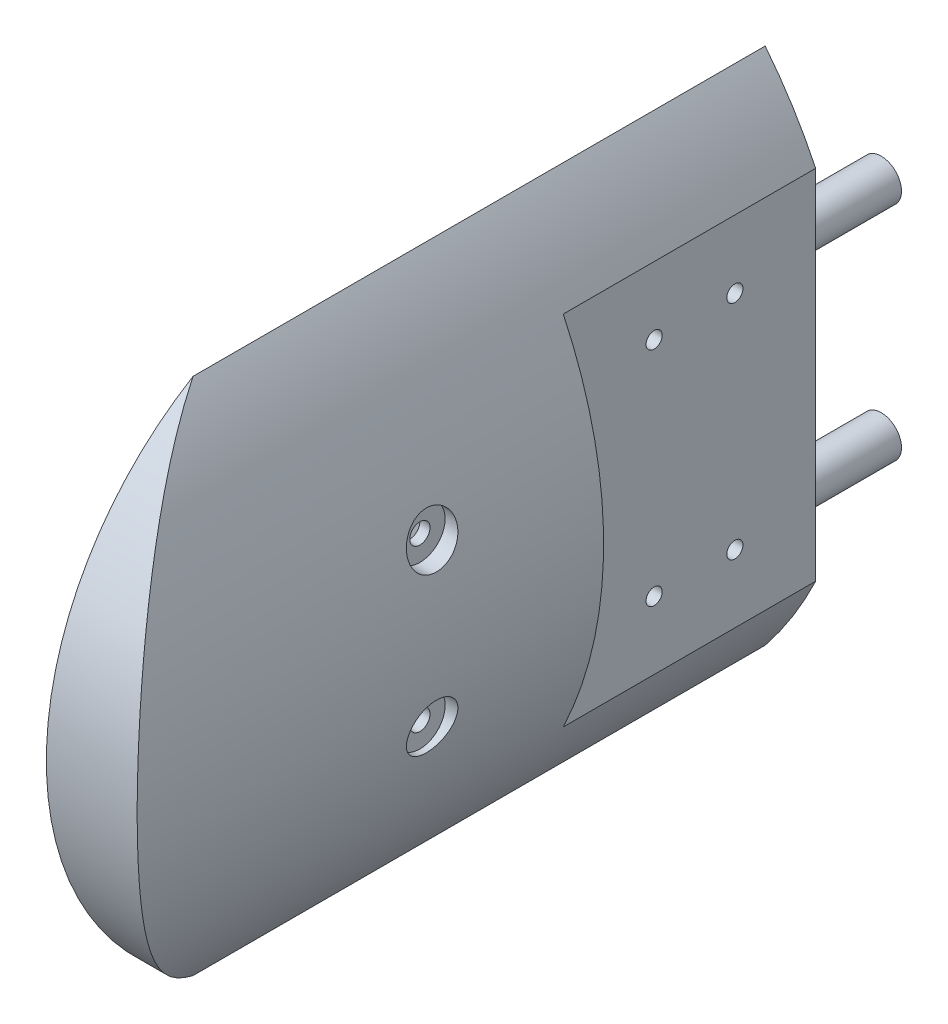
ISO-10303-21;
HEADER;
FILE_DESCRIPTION(('STEP AP214'),'2;1');
FILE_NAME('part.step','',(''),(''),'','','');
FILE_SCHEMA(('AUTOMOTIVE_DESIGN { 1 0 10303 214 1 1 1 1 }'));
ENDSEC;
DATA;
#1=APPLICATION_CONTEXT('core data for automotive mechanical design processes');
#2=APPLICATION_PROTOCOL_DEFINITION('international standard','automotive_design',2000,#1);
#3=PRODUCT_CONTEXT('',#1,'mechanical');
#4=PRODUCT('Part','Part','',(#3));
#5=PRODUCT_RELATED_PRODUCT_CATEGORY('part','',(#4));
#6=PRODUCT_DEFINITION_FORMATION('','',#4);
#7=PRODUCT_DEFINITION_CONTEXT('part definition',#1,'design');
#8=PRODUCT_DEFINITION('design','',#6,#7);
#9=PRODUCT_DEFINITION_SHAPE('','',#8);
#10=(LENGTH_UNIT() NAMED_UNIT(*) SI_UNIT(.MILLI.,.METRE.));
#11=(NAMED_UNIT(*) PLANE_ANGLE_UNIT() SI_UNIT($,.RADIAN.));
#12=(NAMED_UNIT(*) SI_UNIT($,.STERADIAN.) SOLID_ANGLE_UNIT());
#13=UNCERTAINTY_MEASURE_WITH_UNIT(LENGTH_MEASURE(1.E-05),#10,'distance_accuracy_value','');
#14=(GEOMETRIC_REPRESENTATION_CONTEXT(3) GLOBAL_UNCERTAINTY_ASSIGNED_CONTEXT((#13)) GLOBAL_UNIT_ASSIGNED_CONTEXT((#10,
#11,#12)) REPRESENTATION_CONTEXT('',''));
#15=CARTESIAN_POINT('',(0.,0.,0.));
#16=DIRECTION('',(0.,0.,1.));
#17=DIRECTION('',(1.,0.,0.));
#18=AXIS2_PLACEMENT_3D('',#15,#16,#17);
#19=CARTESIAN_POINT('',(0.,0.,0.));
#20=DIRECTION('',(0.,0.,1.));
#21=DIRECTION('',(1.,0.,0.));
#22=AXIS2_PLACEMENT_3D('',#19,#20,#21);
#23=PLANE('',#22);
#24=CARTESIAN_POINT('',(34.7,11.,0.));
#25=DIRECTION('',(0.,0.,1.));
#26=DIRECTION('',(1.,0.,0.));
#27=AXIS2_PLACEMENT_3D('',#24,#25,#26);
#28=CIRCLE('',#27,2.);
#29=CARTESIAN_POINT('',(36.7,11.,0.));
#30=VERTEX_POINT('',#29);
#31=EDGE_CURVE('E148',#30,#30,#28,.F.);
#32=ORIENTED_EDGE('',*,*,#31,.F.);
#33=EDGE_LOOP('',(#32));
#34=FACE_BOUND('',#33,.T.);
#35=CARTESIAN_POINT('',(34.7,-11.,0.));
#36=DIRECTION('',(0.,0.,1.));
#37=DIRECTION('',(1.,0.,0.));
#38=AXIS2_PLACEMENT_3D('',#35,#36,#37);
#39=CIRCLE('',#38,2.);
#40=CARTESIAN_POINT('',(36.7,-11.,0.));
#41=VERTEX_POINT('',#40);
#42=EDGE_CURVE('E256',#41,#41,#39,.F.);
#43=ORIENTED_EDGE('',*,*,#42,.F.);
#44=EDGE_LOOP('',(#43));
#45=FACE_BOUND('',#44,.T.);
#46=DIRECTION('',(0.,-1.,0.));
#47=VECTOR('',#46,1.);
#48=CARTESIAN_POINT('',(37.2,41.2,0.));
#49=LINE('',#48,#47);
#50=CARTESIAN_POINT('',(37.2,17.7087548969429,0.));
#51=VERTEX_POINT('',#50);
#52=CARTESIAN_POINT('',(37.2,-17.7087548969429,0.));
#53=VERTEX_POINT('',#52);
#54=EDGE_CURVE('E104',#51,#53,#49,.T.);
#55=ORIENTED_EDGE('',*,*,#54,.T.);
#56=CARTESIAN_POINT('',(0.,0.,0.));
#57=DIRECTION('',(0.,0.,1.));
#58=DIRECTION('',(1.,0.,0.));
#59=AXIS2_PLACEMENT_3D('',#56,#57,#58);
#60=CIRCLE('',#59,41.2);
#61=CARTESIAN_POINT('',(32.2,-25.7021399887247,0.));
#62=VERTEX_POINT('',#61);
#63=EDGE_CURVE('E125',#62,#53,#60,.T.);
#64=ORIENTED_EDGE('',*,*,#63,.F.);
#65=DIRECTION('',(0.,-1.,0.));
#66=VECTOR('',#65,1.);
#67=CARTESIAN_POINT('',(32.2,30.,0.));
#68=LINE('',#67,#66);
#69=CARTESIAN_POINT('',(32.2,25.7021399887247,0.));
#70=VERTEX_POINT('',#69);
#71=EDGE_CURVE('E124',#70,#62,#68,.T.);
#72=ORIENTED_EDGE('',*,*,#71,.F.);
#73=EDGE_CURVE('E118',#51,#70,#60,.T.);
#74=ORIENTED_EDGE('',*,*,#73,.F.);
#75=EDGE_LOOP('',(#55,#64,#72,#74));
#76=FACE_BOUND('',#75,.T.);
#77=ADVANCED_FACE('F33',(#34,#45,#76),#23,.F.);
#78=CARTESIAN_POINT('',(0.,0.,71.2));
#79=DIRECTION('',(0.,0.,-1.));
#80=DIRECTION('',(-1.,0.,0.));
#81=AXIS2_PLACEMENT_3D('',#78,#79,#80);
#82=CYLINDRICAL_SURFACE('',#81,41.2);
#83=CARTESIAN_POINT('',(40.4158384794872,8.,43.7));
#84=CARTESIAN_POINT('',(40.3874488200087,8.14341814977172,43.699993851619));
#85=CARTESIAN_POINT('',(40.3582686646242,8.28679058669693,43.6876203528362));
#86=CARTESIAN_POINT('',(40.2992302940578,8.5693021367466,43.638545026935));
#87=CARTESIAN_POINT('',(40.2693712366718,8.70843542734807,43.6018111884701));
#88=CARTESIAN_POINT('',(40.2100442227928,8.97838699238411,43.50505933637));
#89=CARTESIAN_POINT('',(40.1805760898978,9.10920912566521,43.44505222177));
#90=CARTESIAN_POINT('',(40.1231628778731,9.3588581198337,43.3033548511906));
#91=CARTESIAN_POINT('',(40.0952173845859,9.47768825011085,43.22167052725));
#92=CARTESIAN_POINT('',(40.0421170720319,9.69958022522378,43.0390243897362));
#93=CARTESIAN_POINT('',(40.0169539892214,9.80268912652775,42.9381222225796));
#94=CARTESIAN_POINT('',(39.9705075524062,9.99039037486735,42.7195683546738));
#95=CARTESIAN_POINT('',(39.9492239113527,10.0749840919778,42.6019178943182));
#96=CARTESIAN_POINT('',(39.9120641001394,10.2211899074132,42.3559913267701));
#97=CARTESIAN_POINT('',(39.8960767005662,10.2832777152367,42.2280150609844));
#98=CARTESIAN_POINT('',(39.8697237347073,10.3849849344061,41.9628852261016));
#99=CARTESIAN_POINT('',(39.8593570217679,10.4246089285795,41.8257335352645));
#100=CARTESIAN_POINT('',(39.8450523076058,10.4791499164161,41.5505692450036));
#101=CARTESIAN_POINT('',(39.8409309459794,10.4947718012849,41.41270564195));
#102=CARTESIAN_POINT('',(39.8387603692902,10.5030088424961,41.1362528687918));
#103=CARTESIAN_POINT('',(39.8407104389306,10.495626709023,40.9976637860789));
#104=CARTESIAN_POINT('',(39.8504923191597,10.4584231014798,40.7260262109388));
#105=CARTESIAN_POINT('',(39.8582294033592,10.4289630018496,40.5929245257327));
#106=CARTESIAN_POINT('',(39.8790636402353,10.3490084610584,40.3336479396408));
#107=CARTESIAN_POINT('',(39.8921609599973,10.298513364208,40.2074732548177));
#108=CARTESIAN_POINT('',(39.923204760442,10.1775066323533,39.9642433896861));
#109=CARTESIAN_POINT('',(39.9411967040955,10.1068070030549,39.8472876814004));
#110=CARTESIAN_POINT('',(39.9811112658613,9.94773584299329,39.6268479486476));
#111=CARTESIAN_POINT('',(40.0030344004685,9.85936198994704,39.523365697462));
#112=CARTESIAN_POINT('',(40.0504958072751,9.66478478880861,39.3297478737677));
#113=CARTESIAN_POINT('',(40.0761172006307,9.55815643191573,39.2400598432521));
#114=CARTESIAN_POINT('',(40.1294134862251,9.33186334680717,39.0797703464737));
#115=CARTESIAN_POINT('',(40.1570886829675,9.21219668425258,39.0091717177033));
#116=CARTESIAN_POINT('',(40.2141895554837,8.95969492613617,38.8871741795935));
#117=CARTESIAN_POINT('',(40.2436422463645,8.8265933759546,38.8363387967584));
#118=CARTESIAN_POINT('',(40.3025288890867,8.55369187540958,38.7579549465723));
#119=CARTESIAN_POINT('',(40.3319628393242,8.41389141397677,38.7304082589472));
#120=CARTESIAN_POINT('',(40.3901643480738,8.1299347588014,38.6992541984676));
#121=CARTESIAN_POINT('',(40.4189215239783,7.985748089716,38.6959038989815));
#122=CARTESIAN_POINT('',(40.4745990528465,7.69858577203517,38.7140705610665));
#123=CARTESIAN_POINT('',(40.5015194552999,7.55561009090214,38.7355868523576));
#124=CARTESIAN_POINT('',(40.5526643464682,7.27608870331014,38.8028214949558));
#125=CARTESIAN_POINT('',(40.5769069641601,7.13950389732806,38.8483632651981));
#126=CARTESIAN_POINT('',(40.6224305089669,6.875758994567,38.9624299828035));
#127=CARTESIAN_POINT('',(40.6437116825641,6.74859811384275,39.0309530158049));
#128=CARTESIAN_POINT('',(40.6826827306307,6.50951542356786,39.1878911967668));
#129=CARTESIAN_POINT('',(40.7004239036946,6.39738508598114,39.2759759349863));
#130=CARTESIAN_POINT('',(40.7325613712332,6.18946953415158,39.4701988616671));
#131=CARTESIAN_POINT('',(40.7469579279631,6.09368303852624,39.5763356335169));
#132=CARTESIAN_POINT('',(40.7721666265748,5.92265303623135,39.8020049253378));
#133=CARTESIAN_POINT('',(40.7830269094097,5.84713631870051,39.921325073635));
#134=CARTESIAN_POINT('',(40.8014500966074,5.717167018744,40.1711665042585));
#135=CARTESIAN_POINT('',(40.8090131705012,5.66271335334585,40.3016872102783));
#136=CARTESIAN_POINT('',(40.8208277439448,5.57690728933548,40.5690025434586));
#137=CARTESIAN_POINT('',(40.8251073427817,5.54535899939332,40.7057330815092));
#138=CARTESIAN_POINT('',(40.8304955593026,5.50554660735572,40.9826035944679));
#139=CARTESIAN_POINT('',(40.8316042522465,5.49728195263456,41.122743488377));
#140=CARTESIAN_POINT('',(40.8306624651687,5.50427223710603,41.4019149701897));
#141=CARTESIAN_POINT('',(40.8286233975148,5.51944221298094,41.5409487334337));
#142=CARTESIAN_POINT('',(40.821389556427,5.57268944185579,41.8144717533413));
#143=CARTESIAN_POINT('',(40.8161948030148,5.61076654951815,41.9489610388322));
#144=CARTESIAN_POINT('',(40.8026128393094,5.70869629289718,42.2096099483339));
#145=CARTESIAN_POINT('',(40.7942251835679,5.76855196693372,42.3357684072112));
#146=CARTESIAN_POINT('',(40.7742264864109,5.90824948716492,42.5761938402587));
#147=CARTESIAN_POINT('',(40.7626155489622,5.98809068871856,42.6904611978129));
#148=CARTESIAN_POINT('',(40.7361247834673,6.1657286357134,42.9043618788397));
#149=CARTESIAN_POINT('',(40.7212327673585,6.26359209898631,43.0039382648635));
#150=CARTESIAN_POINT('',(40.6882775848782,6.47421085908083,43.1852661978893));
#151=CARTESIAN_POINT('',(40.6702135526979,6.58697021968422,43.2670128645355));
#152=CARTESIAN_POINT('',(40.6309193567117,6.82518056664756,43.4111921643335));
#153=CARTESIAN_POINT('',(40.6096611884083,6.95074028854841,43.4734372094249));
#154=CARTESIAN_POINT('',(40.5644410545478,7.20994914348814,43.5759645470361));
#155=CARTESIAN_POINT('',(40.5404820369642,7.34358938415447,43.6162705111518));
#156=CARTESIAN_POINT('',(40.4996071484383,7.56501511493201,43.6634280413118));
#157=CARTESIAN_POINT('',(40.4833544555873,7.6515253348302,43.6771361155018));
#158=CARTESIAN_POINT('',(40.4501116588232,7.82536268272273,43.695423975019));
#159=CARTESIAN_POINT('',(40.4331215535101,7.91268981226776,43.7000037430151));
#160=CARTESIAN_POINT('',(40.4158384794872,8.,43.7));
#161=B_SPLINE_CURVE_WITH_KNOTS('',3,(#83,#84,#85,#86,#87,#88,#89,#90,#91,#92,#93,#94,#95,#96,
#97,#98,#99,#100,#101,#102,#103,#104,#105,#106,#107,#108,#109,#110,#111,#112,#113,#114,#115,
#116,#117,#118,#119,#120,#121,#122,#123,#124,#125,#126,#127,#128,#129,#130,#131,#132,#133,#134,
#135,#136,#137,#138,#139,#140,#141,#142,#143,#144,#145,#146,#147,#148,#149,#150,#151,#152,#153,
#154,#155,#156,#157,#158,#159,#160),.UNSPECIFIED.,.T.,.F.,(4,2,2,2,2,2,2,2,2,2,2,2,2,2,2,2,2,2,
2,2,2,2,2,2,2,2,2,2,2,2,2,2,2,2,2,2,2,2,4),(0.,0.438277245934462,0.877131565901677,
1.31578061504837,1.75430975001877,2.19149937087039,2.62865662989729,3.05594481277372,
3.48314579347587,3.89754331769638,4.31189202213054,4.71960283017297,5.12732634806232,
5.53897448337973,5.95067674227855,6.37374943580731,6.79688498130435,7.23132865208869,
7.66580552012604,8.10489176696983,8.54396617850244,8.97985756600039,9.41571265233449,
9.84470082832865,10.2736553555165,10.6964991128692,11.1193211265051,11.5384830634502,
11.9576350517071,12.3752709480972,12.7929041947647,13.2105957276486,13.6282737894642,
14.0475303537015,14.4669015333464,14.8901909229619,15.3130226863771,15.5798368659597,
15.8466515521219),.UNSPECIFIED.);
#162=CARTESIAN_POINT('',(40.4158384794872,8.,43.7));
#163=VERTEX_POINT('',#162);
#164=EDGE_CURVE('E37',#163,#163,#161,.T.);
#165=ORIENTED_EDGE('',*,*,#164,.T.);
#166=EDGE_LOOP('',(#165));
#167=FACE_BOUND('',#166,.T.);
#168=CARTESIAN_POINT('',(40.4158384794872,-8.,43.7));
#169=CARTESIAN_POINT('',(40.4437959126079,-7.85875438514753,43.6999942712049));
#170=CARTESIAN_POINT('',(40.4710255408898,-7.71726840616302,43.6879942633043));
#171=CARTESIAN_POINT('',(40.5233070010943,-7.43786591144189,43.640109026412));
#172=CARTESIAN_POINT('',(40.5483565556122,-7.29995323166525,43.6041991508406));
#173=CARTESIAN_POINT('',(40.5957244349156,-7.03176404869923,43.5092743840571));
#174=CARTESIAN_POINT('',(40.6180421567259,-6.90148923464842,43.4502544039659));
#175=CARTESIAN_POINT('',(40.6595550986138,-6.65255755550827,43.3106300128299));
#176=CARTESIAN_POINT('',(40.6787511321137,-6.53389766712114,43.2300312391315));
#177=CARTESIAN_POINT('',(40.7135957309824,-6.31312040219875,43.0505238512168));
#178=CARTESIAN_POINT('',(40.7292836262224,-6.21082371301035,42.9518434475697));
#179=CARTESIAN_POINT('',(40.7573021098682,-6.02422206144966,42.738311515313));
#180=CARTESIAN_POINT('',(40.7696328042873,-5.93991653097334,42.6234604975105));
#181=CARTESIAN_POINT('',(40.7907879852309,-5.79284789029476,42.3824373737926));
#182=CARTESIAN_POINT('',(40.7996550405897,-5.729824613931,42.2564276985087));
#183=CARTESIAN_POINT('',(40.8141336149802,-5.62576877915431,41.9954597899364));
#184=CARTESIAN_POINT('',(40.819745280739,-5.58473522962408,41.8605019602657));
#185=CARTESIAN_POINT('',(40.8277229937018,-5.52611191598772,41.5864867273681));
#186=CARTESIAN_POINT('',(40.8301114835342,-5.50836006851821,41.4474646308188));
#187=CARTESIAN_POINT('',(40.8317365560659,-5.49630143421303,41.1683901762867));
#188=CARTESIAN_POINT('',(40.8309732046482,-5.50199415731399,41.0283378399003));
#189=CARTESIAN_POINT('',(40.826293467453,-5.53661081232343,40.7515335742319));
#190=CARTESIAN_POINT('',(40.8223846872243,-5.56547870698989,40.6147745024919));
#191=CARTESIAN_POINT('',(40.8113932439884,-5.64551146812489,40.3480807945803));
#192=CARTESIAN_POINT('',(40.8043105932605,-5.69667624832886,40.2181461320078));
#193=CARTESIAN_POINT('',(40.7869246890924,-5.81984775242566,39.9686112264998));
#194=CARTESIAN_POINT('',(40.7766177076336,-5.89187859479728,39.8490231518083));
#195=CARTESIAN_POINT('',(40.7527716826303,-6.05461317776472,39.623679280447));
#196=CARTESIAN_POINT('',(40.7392325975969,-6.14531715805635,39.5179236613647));
#197=CARTESIAN_POINT('',(40.7088858651144,-6.34323755822189,39.322616753419));
#198=CARTESIAN_POINT('',(40.6920615334967,-6.45053765764642,39.2331528840772));
#199=CARTESIAN_POINT('',(40.6553268898102,-6.67814836634209,39.0734920065477));
#200=CARTESIAN_POINT('',(40.635416442806,-6.79845954443192,39.0032958411811));
#201=CARTESIAN_POINT('',(40.5925430252919,-7.04995560031041,38.8833146630311));
#202=CARTESIAN_POINT('',(40.5695500272132,-7.18124192984379,38.833753129705));
#203=CARTESIAN_POINT('',(40.5210912592719,-7.44981735332777,38.7572967442653));
#204=CARTESIAN_POINT('',(40.4956252912511,-7.58710692783094,38.7304037102447));
#205=CARTESIAN_POINT('',(40.4423832266766,-7.86600866499466,38.6995940794332));
#206=CARTESIAN_POINT('',(40.4145776883238,-8.00765482955911,38.6960362223214));
#207=CARTESIAN_POINT('',(40.3577551086302,-8.28928520653427,38.712788904366));
#208=CARTESIAN_POINT('',(40.3287379508619,-8.42926925756092,38.733101742428));
#209=CARTESIAN_POINT('',(40.269967597674,-8.70574367167804,38.7974270637844));
#210=CARTESIAN_POINT('',(40.240209818277,-8.84215485294639,38.8417761355231));
#211=CARTESIAN_POINT('',(40.1814284321096,-9.10554976709774,38.9531780760765));
#212=CARTESIAN_POINT('',(40.1524048646406,-9.23253299601642,39.0202321575071));
#213=CARTESIAN_POINT('',(40.0961640514213,-9.4738078314491,39.1755176739196));
#214=CARTESIAN_POINT('',(40.0689521423977,-9.58806255546996,39.2638084234522));
#215=CARTESIAN_POINT('',(40.0176314172557,-9.80005580989393,39.4591473909246));
#216=CARTESIAN_POINT('',(39.9935223785263,-9.89779552530131,39.5661942619295));
#217=CARTESIAN_POINT('',(39.9499504305545,-10.0722108991309,39.794224401793));
#218=CARTESIAN_POINT('',(39.9304173698055,-10.1492077552875,39.914948331295));
#219=CARTESIAN_POINT('',(39.896511001836,-10.2816881324438,40.1683381265994));
#220=CARTESIAN_POINT('',(39.882136698062,-10.3371758086904,40.3010016797401));
#221=CARTESIAN_POINT('',(39.859689329202,-10.4233921713204,40.5702699285324));
#222=CARTESIAN_POINT('',(39.8514415955919,-10.4548080471781,40.7066401142888));
#223=CARTESIAN_POINT('',(39.8410173693595,-10.4944636389581,40.9829305934769));
#224=CARTESIAN_POINT('',(39.8388399199877,-10.502707007147,41.1228503239494));
#225=CARTESIAN_POINT('',(39.8406566201268,-10.4958127376128,41.3988474827141));
#226=CARTESIAN_POINT('',(39.8445104829379,-10.4812065769392,41.534939482561));
#227=CARTESIAN_POINT('',(39.8579190744296,-10.4300995203303,41.8026491366894));
#228=CARTESIAN_POINT('',(39.8674737170057,-10.3935989550882,41.9342668585186));
#229=CARTESIAN_POINT('',(39.8917923880317,-10.2998654807256,42.1895056350876));
#230=CARTESIAN_POINT('',(39.9065610673271,-10.2426140609237,42.3131194335665));
#231=CARTESIAN_POINT('',(39.9405715173018,-10.1091774581913,42.5489753198648));
#232=CARTESIAN_POINT('',(39.9598135914606,-10.0329909906638,42.6612166354214));
#233=CARTESIAN_POINT('',(40.0023757979192,-9.86193980103424,42.8739905345158));
#234=CARTESIAN_POINT('',(40.0257804833613,-9.76668132816365,42.9741894725721));
#235=CARTESIAN_POINT('',(40.0753212895873,-9.56136810126384,43.1573098240278));
#236=CARTESIAN_POINT('',(40.1014584576342,-9.45130766950873,43.240224576295));
#237=CARTESIAN_POINT('',(40.1562107466227,-9.21595098300453,43.3889299578124));
#238=CARTESIAN_POINT('',(40.1848763740691,-9.09029962092155,43.4541396563142));
#239=CARTESIAN_POINT('',(40.2428641732445,-8.83003939874086,43.5623848049536));
#240=CARTESIAN_POINT('',(40.2721856543484,-8.69543969163171,43.6054425312882));
#241=CARTESIAN_POINT('',(40.3207376332588,-8.4668114081522,43.6578241532061));
#242=CARTESIAN_POINT('',(40.3400701868757,-8.37423368427469,43.6736104062538));
#243=CARTESIAN_POINT('',(40.3783220051591,-8.18780610354163,43.6947003003079));
#244=CARTESIAN_POINT('',(40.3972412646762,-8.09395623085958,43.7000038107802));
#245=CARTESIAN_POINT('',(40.4158384794872,-8.,43.7));
#246=B_SPLINE_CURVE_WITH_KNOTS('',3,(#168,#169,#170,#171,#172,#173,#174,#175,#176,#177,#178,
#179,#180,#181,#182,#183,#184,#185,#186,#187,#188,#189,#190,#191,#192,#193,#194,#195,#196,#197,
#198,#199,#200,#201,#202,#203,#204,#205,#206,#207,#208,#209,#210,#211,#212,#213,#214,#215,#216,
#217,#218,#219,#220,#221,#222,#223,#224,#225,#226,#227,#228,#229,#230,#231,#232,#233,#234,#235,
#236,#237,#238,#239,#240,#241,#242,#243,#244,#245),.UNSPECIFIED.,.T.,.F.,(4,2,2,2,2,2,2,2,2,2,2,
2,2,2,2,2,2,2,2,2,2,2,2,2,2,2,2,2,2,2,2,2,2,2,2,2,2,2,4),(0.,0.431615601195683,
0.863676807180421,1.29583320723285,1.72787681867188,2.15480239967814,2.58171449772597,
3.00320095978975,3.42466842308826,3.84318584433871,4.26169451733679,4.67919427917192,
5.09669242575351,5.51467508517596,5.93266311032403,6.35283185557269,6.77301897720114,
7.19764538322662,7.62230584253738,8.05347975083446,8.48469518743172,8.92211127672987,
9.35955073097702,9.79822644931342,10.2368706778969,10.6682711182367,11.0995881769826,
11.5180791896189,11.9365042393241,12.345340535705,12.7541706571765,13.1633663744277,
13.5725898600321,13.9913457725917,14.410262771854,14.8416065190282,15.2725156514996,
15.5596216982514,15.8467313201033),.UNSPECIFIED.);
#247=CARTESIAN_POINT('',(40.4158384794872,-8.,43.7));
#248=VERTEX_POINT('',#247);
#249=EDGE_CURVE('E160',#248,#248,#246,.T.);
#250=ORIENTED_EDGE('',*,*,#249,.T.);
#251=EDGE_LOOP('',(#250));
#252=FACE_BOUND('',#251,.T.);
#253=DIRECTION('',(0.,0.,-1.));
#254=VECTOR('',#253,1.);
#255=CARTESIAN_POINT('',(37.2,-17.708754896943,71.2));
#256=LINE('',#255,#254);
#257=CARTESIAN_POINT('',(37.2,-17.7087548969429,25.));
#258=VERTEX_POINT('',#257);
#259=EDGE_CURVE('E12',#258,#53,#256,.T.);
#260=ORIENTED_EDGE('',*,*,#259,.F.);
#261=CARTESIAN_POINT('',(0.,0.,25.));
#262=DIRECTION('',(0.,0.,1.));
#263=DIRECTION('',(1.,0.,0.));
#264=AXIS2_PLACEMENT_3D('',#261,#262,#263);
#265=CIRCLE('',#264,41.2);
#266=CARTESIAN_POINT('',(37.2,17.7087548969429,25.));
#267=VERTEX_POINT('',#266);
#268=EDGE_CURVE('E120',#258,#267,#265,.T.);
#269=ORIENTED_EDGE('',*,*,#268,.T.);
#270=DIRECTION('',(0.,0.,-1.));
#271=VECTOR('',#270,1.);
#272=CARTESIAN_POINT('',(37.2,17.708754896943,71.2));
#273=LINE('',#272,#271);
#274=EDGE_CURVE('E47',#51,#267,#273,.F.);
#275=ORIENTED_EDGE('',*,*,#274,.F.);
#276=ORIENTED_EDGE('',*,*,#73,.T.);
#277=DIRECTION('',(0.,0.,-1.));
#278=VECTOR('',#277,1.);
#279=CARTESIAN_POINT('',(32.2,25.7021399887247,71.2));
#280=LINE('',#279,#278);
#281=CARTESIAN_POINT('',(32.2,25.7021399887247,56.6725563498731));
#282=VERTEX_POINT('',#281);
#283=EDGE_CURVE('E128',#282,#70,#280,.T.);
#284=ORIENTED_EDGE('',*,*,#283,.F.);
#285=CARTESIAN_POINT('',(32.2,25.7021399887247,56.6725563498731));
#286=CARTESIAN_POINT('',(32.3832138892177,25.4726189813378,57.0537999712829));
#287=CARTESIAN_POINT('',(32.5687437803086,25.2351398452685,57.4291120604379));
#288=CARTESIAN_POINT('',(32.9430053907642,24.7445632410395,58.1677142847544));
#289=CARTESIAN_POINT('',(33.1317369605654,24.4914665009928,58.5310049791577));
#290=CARTESIAN_POINT('',(33.5110400931817,23.9698610353998,59.2455371553149));
#291=CARTESIAN_POINT('',(33.7016121372567,23.7013481827085,59.5967753698348));
#292=CARTESIAN_POINT('',(34.0832251546522,23.1492210061003,60.2868766225504));
#293=CARTESIAN_POINT('',(34.2742661357326,22.865606430656,60.6257394544688));
#294=CARTESIAN_POINT('',(34.8501139922286,21.986436160516,61.6302222572546));
#295=CARTESIAN_POINT('',(35.2337883896713,21.3677930670704,62.2765543610257));
#296=CARTESIAN_POINT('',(35.9882007731069,20.0711772347665,63.5148242795697));
#297=CARTESIAN_POINT('',(36.3589395016404,19.3932079092487,64.1067652197314));
#298=CARTESIAN_POINT('',(37.0795976583417,17.9771181164986,65.2342482100734));
#299=CARTESIAN_POINT('',(37.4294428503803,17.2388029622384,65.7695938239334));
#300=CARTESIAN_POINT('',(38.0979762354592,15.7061354372568,66.776503070715));
#301=CARTESIAN_POINT('',(38.4166619853857,14.9117786808825,67.2480617034099));
#302=CARTESIAN_POINT('',(38.8637974186817,13.6833609590188,67.9016799617233));
#303=CARTESIAN_POINT('',(39.0074193027183,13.2686672553913,68.110210425929));
#304=CARTESIAN_POINT('',(39.2836496944944,12.4270233422429,68.5090802806238));
#305=CARTESIAN_POINT('',(39.416258921146,12.0000739352332,68.6994208586808));
#306=CARTESIAN_POINT('',(39.669349270539,11.1348904481449,69.0609749406149));
#307=CARTESIAN_POINT('',(39.7898362810046,10.6966619774322,69.2321977344222));
#308=CARTESIAN_POINT('',(40.0177834073551,9.80952830042177,69.5548234700837));
#309=CARTESIAN_POINT('',(40.1252403286927,9.36062050804568,69.7062215522974));
#310=CARTESIAN_POINT('',(40.3706029808209,8.25248007233838,70.0507549596349));
#311=CARTESIAN_POINT('',(40.5009523597203,7.58804644432396,70.2327297156771));
#312=CARTESIAN_POINT('',(40.7299493724418,6.24309970759923,70.5513382841633));
#313=CARTESIAN_POINT('',(40.82860377056,5.56259006313468,70.6879817713432));
#314=CARTESIAN_POINT('',(40.9513217371004,4.53309062539906,70.8575829889077));
#315=CARTESIAN_POINT('',(40.9880212558138,4.18840832666422,70.9082283891545));
#316=CARTESIAN_POINT('',(41.0528109270044,3.49676276767357,70.9975540630588));
#317=CARTESIAN_POINT('',(41.0809027485783,3.14979996297004,71.0362366564074));
#318=CARTESIAN_POINT('',(41.1520296210891,2.10623546153597,71.1341220445535));
#319=CARTESIAN_POINT('',(41.181923595423,1.40689493878156,71.1751728068208));
#320=CARTESIAN_POINT('',(41.2059677914764,0.00567508676613997,71.2081969477766));
#321=CARTESIAN_POINT('',(41.2000743772428,-0.696206298570247,71.2001104128148));
#322=CARTESIAN_POINT('',(41.1525873924758,-2.09648047999342,71.1348618534472));
#323=CARTESIAN_POINT('',(41.1109940037415,-2.79487329382725,71.077700078953));
#324=CARTESIAN_POINT('',(40.9930132732122,-4.18309125688186,70.9151519329094));
#325=CARTESIAN_POINT('',(40.9166224037396,-4.87291553016102,70.8097606719759));
#326=CARTESIAN_POINT('',(40.7306715840989,-6.2392122798027,70.5522662227643));
#327=CARTESIAN_POINT('',(40.6211113825177,-6.91568465492059,70.4001626804217));
#328=CARTESIAN_POINT('',(40.372566420266,-8.24295059664285,70.0533974734119));
#329=CARTESIAN_POINT('',(40.2339569543076,-8.89395676089203,69.8592776686776));
#330=CARTESIAN_POINT('',(39.9291062560383,-10.1754768104923,69.4297081129827));
#331=CARTESIAN_POINT('',(39.7628653573204,-10.8059909431329,69.1942588609886));
#332=CARTESIAN_POINT('',(39.4055628257925,-12.0439538982792,68.6843858665231));
#333=CARTESIAN_POINT('',(39.2144945578438,-12.6513964986118,68.4099517034618));
#334=CARTESIAN_POINT('',(38.8106163679833,-13.8409054968925,67.8245905067868));
#335=CARTESIAN_POINT('',(38.5978053594019,-14.4229706244365,67.5136616491075));
#336=CARTESIAN_POINT('',(38.125598875771,-15.6317318600363,66.816307487358));
#337=CARTESIAN_POINT('',(37.8637120237703,-16.254815272272,66.4253058075275));
#338=CARTESIAN_POINT('',(37.3209201837736,-17.4650761842656,65.6030018423277));
#339=CARTESIAN_POINT('',(37.0400130382853,-18.0522495962882,65.1716949829822));
#340=CARTESIAN_POINT('',(36.463709864786,-19.1896987883491,64.2712352048799));
#341=CARTESIAN_POINT('',(36.1683074265685,-19.739957984622,63.8020654819397));
#342=CARTESIAN_POINT('',(35.5678750237778,-20.8023671518241,62.8282394292182));
#343=CARTESIAN_POINT('',(35.2628461759958,-21.3145215204407,62.3235872075967));
#344=CARTESIAN_POINT('',(34.7248629848536,-22.1768748445841,61.4107878232447));
#345=CARTESIAN_POINT('',(34.4929362420895,-22.535574148333,61.0100201395113));
#346=CARTESIAN_POINT('',(34.0286114769505,-23.2307617134127,60.1900121002737));
#347=CARTESIAN_POINT('',(33.7962135237263,-23.5672530205304,59.7707742911207));
#348=CARTESIAN_POINT('',(33.3338315961712,-24.2168138209311,58.9153519490632));
#349=CARTESIAN_POINT('',(33.1038428172516,-24.5299437474852,58.4792159152175));
#350=CARTESIAN_POINT('',(32.6481061271431,-25.133334540322,57.5891489040581));
#351=CARTESIAN_POINT('',(32.4223589227172,-25.4235916206502,57.1352149993525));
#352=CARTESIAN_POINT('',(32.2,-25.7021399887247,56.6725563498731));
#353=B_SPLINE_CURVE_WITH_KNOTS('',3,(#285,#286,#287,#288,#289,#290,#291,#292,#293,#294,#295,
#296,#297,#298,#299,#300,#301,#302,#303,#304,#305,#306,#307,#308,#309,#310,#311,#312,#313,#314,
#315,#316,#317,#318,#319,#320,#321,#322,#323,#324,#325,#326,#327,#328,#329,#330,#331,#332,#333,
#334,#335,#336,#337,#338,#339,#340,#341,#342,#343,#344,#345,#346,#347,#348,#349,#350,#351,#352),
.UNSPECIFIED.,.F.,.F.,(4,2,2,2,2,2,2,2,2,2,2,2,2,2,2,2,2,2,2,2,2,2,2,2,2,2,2,2,2,2,2,2,2,4),(0.,
1.4435848868594,2.88710252268938,4.33100843029514,5.77493839446321,8.69178488953529,
11.6084636737645,14.5349547333468,17.4616750661926,18.9188159409231,20.3758616178286,
21.8321961605656,23.2888870296032,25.389920496778,27.4905052661587,28.5411588603057,
29.591608595772,31.6923166101212,33.7955865545564,35.8988457883334,38.0023182924972,
40.1058067407249,42.1836320957383,44.2614323670827,46.339789079072,48.41824971506,
50.7585013208226,53.0990188299837,55.4405808743855,57.7818722579977,59.5383673747446,
61.2946210885757,63.0461615733626,64.797991369949),.UNSPECIFIED.);
#354=CARTESIAN_POINT('',(32.2,-25.7021399887247,56.6725563498731));
#355=VERTEX_POINT('',#354);
#356=EDGE_CURVE('E62',#282,#355,#353,.T.);
#357=ORIENTED_EDGE('',*,*,#356,.T.);
#358=DIRECTION('',(0.,0.,-1.));
#359=VECTOR('',#358,1.);
#360=CARTESIAN_POINT('',(32.2,-25.7021399887247,71.2));
#361=LINE('',#360,#359);
#362=EDGE_CURVE('E135',#62,#355,#361,.F.);
#363=ORIENTED_EDGE('',*,*,#362,.F.);
#364=ORIENTED_EDGE('',*,*,#63,.T.);
#365=EDGE_LOOP('',(#260,#269,#275,#276,#284,#357,#363,#364));
#366=FACE_BOUND('',#365,.T.);
#367=ADVANCED_FACE('F117',(#167,#252,#366),#82,.T.);
#368=CARTESIAN_POINT('',(32.2,30.,41.2));
#369=DIRECTION('',(1.,0.,0.));
#370=DIRECTION('',(0.,0.,-1.));
#371=AXIS2_PLACEMENT_3D('',#368,#369,#370);
#372=PLANE('',#371);
#373=CARTESIAN_POINT('',(32.2,-11.,8.));
#374=DIRECTION('',(1.,0.,0.));
#375=DIRECTION('',(0.,0.,-1.));
#376=AXIS2_PLACEMENT_3D('',#373,#374,#375);
#377=CIRCLE('',#376,0.800000000000001);
#378=CARTESIAN_POINT('',(32.2,-11.,7.2));
#379=VERTEX_POINT('',#378);
#380=EDGE_CURVE('E451',#379,#379,#377,.T.);
#381=ORIENTED_EDGE('',*,*,#380,.T.);
#382=EDGE_LOOP('',(#381));
#383=FACE_BOUND('',#382,.T.);
#384=CARTESIAN_POINT('',(32.2,11.,16.));
#385=DIRECTION('',(1.,0.,0.));
#386=DIRECTION('',(0.,0.,-1.));
#387=AXIS2_PLACEMENT_3D('',#384,#385,#386);
#388=CIRCLE('',#387,0.800000000000001);
#389=CARTESIAN_POINT('',(32.2,11.,15.2));
#390=VERTEX_POINT('',#389);
#391=EDGE_CURVE('E458',#390,#390,#388,.T.);
#392=ORIENTED_EDGE('',*,*,#391,.T.);
#393=EDGE_LOOP('',(#392));
#394=FACE_BOUND('',#393,.T.);
#395=CARTESIAN_POINT('',(32.2,11.,8.));
#396=DIRECTION('',(1.,0.,0.));
#397=DIRECTION('',(0.,0.,-1.));
#398=AXIS2_PLACEMENT_3D('',#395,#396,#397);
#399=CIRCLE('',#398,0.800000000000001);
#400=CARTESIAN_POINT('',(32.2,11.,7.2));
#401=VERTEX_POINT('',#400);
#402=EDGE_CURVE('E445',#401,#401,#399,.T.);
#403=ORIENTED_EDGE('',*,*,#402,.T.);
#404=EDGE_LOOP('',(#403));
#405=FACE_BOUND('',#404,.T.);
#406=CARTESIAN_POINT('',(32.2,-11.,16.));
#407=DIRECTION('',(1.,0.,0.));
#408=DIRECTION('',(0.,0.,-1.));
#409=AXIS2_PLACEMENT_3D('',#406,#407,#408);
#410=CIRCLE('',#409,0.800000000000001);
#411=CARTESIAN_POINT('',(32.2,-11.,15.2));
#412=VERTEX_POINT('',#411);
#413=EDGE_CURVE('E114',#412,#412,#410,.T.);
#414=ORIENTED_EDGE('',*,*,#413,.T.);
#415=EDGE_LOOP('',(#414));
#416=FACE_BOUND('',#415,.T.);
#417=CARTESIAN_POINT('',(32.2,0.,41.2));
#418=DIRECTION('',(-1.,0.,0.));
#419=DIRECTION('',(0.,0.,1.));
#420=AXIS2_PLACEMENT_3D('',#417,#418,#419);
#421=CIRCLE('',#420,15.7);
#422=CARTESIAN_POINT('',(32.2,0.,56.9));
#423=VERTEX_POINT('',#422);
#424=EDGE_CURVE('E130',#423,#423,#421,.T.);
#425=ORIENTED_EDGE('',*,*,#424,.F.);
#426=EDGE_LOOP('',(#425));
#427=FACE_BOUND('',#426,.T.);
#428=ORIENTED_EDGE('',*,*,#71,.T.);
#429=ORIENTED_EDGE('',*,*,#362,.T.);
#430=CARTESIAN_POINT('',(32.2,0.,41.2));
#431=DIRECTION('',(-1.,0.,0.));
#432=DIRECTION('',(0.,0.,1.));
#433=AXIS2_PLACEMENT_3D('',#430,#431,#432);
#434=CIRCLE('',#433,30.);
#435=EDGE_CURVE('E138',#355,#282,#434,.T.);
#436=ORIENTED_EDGE('',*,*,#435,.T.);
#437=ORIENTED_EDGE('',*,*,#283,.T.);
#438=EDGE_LOOP('',(#428,#429,#436,#437));
#439=FACE_BOUND('',#438,.T.);
#440=ADVANCED_FACE('F35',(#383,#394,#405,#416,#427,#439),#372,.F.);
#441=CARTESIAN_POINT('',(41.2,0.,41.2));
#442=DIRECTION('',(-1.,0.,0.));
#443=DIRECTION('',(0.,0.,1.));
#444=AXIS2_PLACEMENT_3D('',#441,#442,#443);
#445=CYLINDRICAL_SURFACE('',#444,30.);
#446=ORIENTED_EDGE('',*,*,#356,.F.);
#447=ORIENTED_EDGE('',*,*,#435,.F.);
#448=EDGE_LOOP('',(#446,#447));
#449=FACE_BOUND('',#448,.T.);
#450=ADVANCED_FACE('F150',(#449),#445,.T.);
#451=CARTESIAN_POINT('',(35.2,0.,41.2));
#452=DIRECTION('',(-1.,0.,0.));
#453=DIRECTION('',(0.,0.,1.));
#454=AXIS2_PLACEMENT_3D('',#451,#452,#453);
#455=CYLINDRICAL_SURFACE('',#454,15.7);
#456=CARTESIAN_POINT('',(35.2,0.,41.2));
#457=DIRECTION('',(-1.,0.,0.));
#458=DIRECTION('',(0.,0.,1.));
#459=AXIS2_PLACEMENT_3D('',#456,#457,#458);
#460=CIRCLE('',#459,15.7);
#461=CARTESIAN_POINT('',(35.2,0.,56.9));
#462=VERTEX_POINT('',#461);
#463=EDGE_CURVE('E126',#462,#462,#460,.T.);
#464=ORIENTED_EDGE('',*,*,#463,.F.);
#465=EDGE_LOOP('',(#464));
#466=FACE_BOUND('',#465,.T.);
#467=ORIENTED_EDGE('',*,*,#424,.T.);
#468=EDGE_LOOP('',(#467));
#469=FACE_BOUND('',#468,.T.);
#470=ADVANCED_FACE('F156',(#466,#469),#455,.F.);
#471=CARTESIAN_POINT('',(35.2,0.,41.2));
#472=DIRECTION('',(-1.,0.,0.));
#473=DIRECTION('',(0.,0.,1.));
#474=AXIS2_PLACEMENT_3D('',#471,#472,#473);
#475=PLANE('',#474);
#476=DIRECTION('',(0.,-1.,0.));
#477=VECTOR('',#476,1.);
#478=CARTESIAN_POINT('',(35.2,14.,39.2));
#479=LINE('',#478,#477);
#480=CARTESIAN_POINT('',(35.2,14.,39.2));
#481=VERTEX_POINT('',#480);
#482=CARTESIAN_POINT('',(35.2,-14.,39.2));
#483=VERTEX_POINT('',#482);
#484=EDGE_CURVE('E55',#481,#483,#479,.T.);
#485=ORIENTED_EDGE('',*,*,#484,.F.);
#486=DIRECTION('',(0.,0.,-1.));
#487=VECTOR('',#486,1.);
#488=CARTESIAN_POINT('',(35.2,14.,39.2));
#489=LINE('',#488,#487);
#490=CARTESIAN_POINT('',(35.2,14.,43.2));
#491=VERTEX_POINT('',#490);
#492=EDGE_CURVE('E478',#491,#481,#489,.T.);
#493=ORIENTED_EDGE('',*,*,#492,.F.);
#494=DIRECTION('',(0.,1.,0.));
#495=VECTOR('',#494,1.);
#496=CARTESIAN_POINT('',(35.2,14.,43.2));
#497=LINE('',#496,#495);
#498=CARTESIAN_POINT('',(35.2,-14.,43.2));
#499=VERTEX_POINT('',#498);
#500=EDGE_CURVE('E492',#499,#491,#497,.T.);
#501=ORIENTED_EDGE('',*,*,#500,.F.);
#502=DIRECTION('',(0.,0.,1.));
#503=VECTOR('',#502,1.);
#504=CARTESIAN_POINT('',(35.2,-14.,39.2));
#505=LINE('',#504,#503);
#506=EDGE_CURVE('E489',#483,#499,#505,.T.);
#507=ORIENTED_EDGE('',*,*,#506,.F.);
#508=EDGE_LOOP('',(#485,#493,#501,#507));
#509=FACE_BOUND('',#508,.T.);
#510=ORIENTED_EDGE('',*,*,#463,.T.);
#511=EDGE_LOOP('',(#510));
#512=FACE_BOUND('',#511,.T.);
#513=ADVANCED_FACE('F239',(#509,#512),#475,.T.);
#514=CARTESIAN_POINT('',(38.2,14.,39.2));
#515=DIRECTION('',(0.,0.,-1.));
#516=DIRECTION('',(-1.,0.,0.));
#517=AXIS2_PLACEMENT_3D('',#514,#515,#516);
#518=PLANE('',#517);
#519=ORIENTED_EDGE('',*,*,#484,.T.);
#520=DIRECTION('',(-1.,0.,0.));
#521=VECTOR('',#520,1.);
#522=CARTESIAN_POINT('',(38.2,-14.,39.2));
#523=LINE('',#522,#521);
#524=CARTESIAN_POINT('',(38.2,-14.,39.2));
#525=VERTEX_POINT('',#524);
#526=EDGE_CURVE('E487',#525,#483,#523,.T.);
#527=ORIENTED_EDGE('',*,*,#526,.F.);
#528=DIRECTION('',(0.,-1.,0.));
#529=VECTOR('',#528,1.);
#530=CARTESIAN_POINT('',(38.2,14.,39.2));
#531=LINE('',#530,#529);
#532=CARTESIAN_POINT('',(38.2,14.,39.2));
#533=VERTEX_POINT('',#532);
#534=EDGE_CURVE('E474',#533,#525,#531,.T.);
#535=ORIENTED_EDGE('',*,*,#534,.F.);
#536=DIRECTION('',(-1.,0.,0.));
#537=VECTOR('',#536,1.);
#538=CARTESIAN_POINT('',(38.2,14.,39.2));
#539=LINE('',#538,#537);
#540=EDGE_CURVE('E497',#533,#481,#539,.T.);
#541=ORIENTED_EDGE('',*,*,#540,.T.);
#542=EDGE_LOOP('',(#519,#527,#535,#541));
#543=FACE_BOUND('',#542,.T.);
#544=ADVANCED_FACE('F230',(#543),#518,.F.);
#545=CARTESIAN_POINT('',(38.2,14.,39.2));
#546=DIRECTION('',(0.,1.,0.));
#547=DIRECTION('',(0.,0.,1.));
#548=AXIS2_PLACEMENT_3D('',#545,#546,#547);
#549=PLANE('',#548);
#550=ORIENTED_EDGE('',*,*,#492,.T.);
#551=ORIENTED_EDGE('',*,*,#540,.F.);
#552=DIRECTION('',(0.,0.,-1.));
#553=VECTOR('',#552,1.);
#554=CARTESIAN_POINT('',(38.2,14.,39.2));
#555=LINE('',#554,#553);
#556=CARTESIAN_POINT('',(38.2,14.,43.2));
#557=VERTEX_POINT('',#556);
#558=EDGE_CURVE('E484',#557,#533,#555,.T.);
#559=ORIENTED_EDGE('',*,*,#558,.F.);
#560=DIRECTION('',(-1.,0.,0.));
#561=VECTOR('',#560,1.);
#562=CARTESIAN_POINT('',(38.2,14.,43.2));
#563=LINE('',#562,#561);
#564=EDGE_CURVE('E499',#557,#491,#563,.T.);
#565=ORIENTED_EDGE('',*,*,#564,.T.);
#566=EDGE_LOOP('',(#550,#551,#559,#565));
#567=FACE_BOUND('',#566,.T.);
#568=ADVANCED_FACE('F226',(#567),#549,.F.);
#569=CARTESIAN_POINT('',(38.2,14.,43.2));
#570=DIRECTION('',(0.,0.,1.));
#571=DIRECTION('',(1.,0.,0.));
#572=AXIS2_PLACEMENT_3D('',#569,#570,#571);
#573=PLANE('',#572);
#574=ORIENTED_EDGE('',*,*,#500,.T.);
#575=ORIENTED_EDGE('',*,*,#564,.F.);
#576=DIRECTION('',(0.,1.,0.));
#577=VECTOR('',#576,1.);
#578=CARTESIAN_POINT('',(38.2,14.,43.2));
#579=LINE('',#578,#577);
#580=CARTESIAN_POINT('',(38.2,-14.,43.2));
#581=VERTEX_POINT('',#580);
#582=EDGE_CURVE('E481',#581,#557,#579,.T.);
#583=ORIENTED_EDGE('',*,*,#582,.F.);
#584=DIRECTION('',(-1.,0.,0.));
#585=VECTOR('',#584,1.);
#586=CARTESIAN_POINT('',(38.2,-14.,43.2));
#587=LINE('',#586,#585);
#588=EDGE_CURVE('E501',#581,#499,#587,.T.);
#589=ORIENTED_EDGE('',*,*,#588,.T.);
#590=EDGE_LOOP('',(#574,#575,#583,#589));
#591=FACE_BOUND('',#590,.T.);
#592=ADVANCED_FACE('F229',(#591),#573,.F.);
#593=CARTESIAN_POINT('',(38.2,-14.,39.2));
#594=DIRECTION('',(0.,-1.,0.));
#595=DIRECTION('',(0.,0.,-1.));
#596=AXIS2_PLACEMENT_3D('',#593,#594,#595);
#597=PLANE('',#596);
#598=ORIENTED_EDGE('',*,*,#506,.T.);
#599=ORIENTED_EDGE('',*,*,#588,.F.);
#600=DIRECTION('',(0.,0.,1.));
#601=VECTOR('',#600,1.);
#602=CARTESIAN_POINT('',(38.2,-14.,39.2));
#603=LINE('',#602,#601);
#604=EDGE_CURVE('E477',#525,#581,#603,.T.);
#605=ORIENTED_EDGE('',*,*,#604,.F.);
#606=ORIENTED_EDGE('',*,*,#526,.T.);
#607=EDGE_LOOP('',(#598,#599,#605,#606));
#608=FACE_BOUND('',#607,.T.);
#609=ADVANCED_FACE('F224',(#608),#597,.F.);
#610=CARTESIAN_POINT('',(38.2,0.,0.));
#611=DIRECTION('',(-1.,0.,0.));
#612=DIRECTION('',(0.,0.,1.));
#613=AXIS2_PLACEMENT_3D('',#610,#611,#612);
#614=PLANE('',#613);
#615=CARTESIAN_POINT('',(38.2,8.,41.2));
#616=DIRECTION('',(-1.,0.,0.));
#617=DIRECTION('',(0.,0.,1.));
#618=AXIS2_PLACEMENT_3D('',#615,#616,#617);
#619=CIRCLE('',#618,0.999999999999998);
#620=CARTESIAN_POINT('',(38.2,8.,42.2));
#621=VERTEX_POINT('',#620);
#622=EDGE_CURVE('E436',#621,#621,#619,.T.);
#623=ORIENTED_EDGE('',*,*,#622,.F.);
#624=EDGE_LOOP('',(#623));
#625=FACE_BOUND('',#624,.T.);
#626=CARTESIAN_POINT('',(38.2,-8.,41.2));
#627=DIRECTION('',(-1.,0.,0.));
#628=DIRECTION('',(0.,0.,1.));
#629=AXIS2_PLACEMENT_3D('',#626,#627,#628);
#630=CIRCLE('',#629,0.999999999999998);
#631=CARTESIAN_POINT('',(38.2,-8.,42.2));
#632=VERTEX_POINT('',#631);
#633=EDGE_CURVE('E440',#632,#632,#630,.T.);
#634=ORIENTED_EDGE('',*,*,#633,.F.);
#635=EDGE_LOOP('',(#634));
#636=FACE_BOUND('',#635,.T.);
#637=ORIENTED_EDGE('',*,*,#534,.T.);
#638=ORIENTED_EDGE('',*,*,#604,.T.);
#639=ORIENTED_EDGE('',*,*,#582,.T.);
#640=ORIENTED_EDGE('',*,*,#558,.T.);
#641=EDGE_LOOP('',(#637,#638,#639,#640));
#642=FACE_BOUND('',#641,.T.);
#643=ADVANCED_FACE('F220',(#625,#636,#642),#614,.T.);
#644=CARTESIAN_POINT('',(34.7,11.,-9.));
#645=DIRECTION('',(0.,0.,1.));
#646=DIRECTION('',(1.,0.,0.));
#647=AXIS2_PLACEMENT_3D('',#644,#645,#646);
#648=CYLINDRICAL_SURFACE('',#647,2.);
#649=CARTESIAN_POINT('',(34.7,11.,-9.));
#650=DIRECTION('',(0.,0.,-1.));
#651=DIRECTION('',(-1.,0.,0.));
#652=AXIS2_PLACEMENT_3D('',#649,#650,#651);
#653=CIRCLE('',#652,2.);
#654=CARTESIAN_POINT('',(32.7,11.,-9.));
#655=VERTEX_POINT('',#654);
#656=EDGE_CURVE('E471',#655,#655,#653,.T.);
#657=ORIENTED_EDGE('',*,*,#656,.F.);
#658=EDGE_LOOP('',(#657));
#659=FACE_BOUND('',#658,.T.);
#660=ORIENTED_EDGE('',*,*,#31,.T.);
#661=EDGE_LOOP('',(#660));
#662=FACE_BOUND('',#661,.T.);
#663=ADVANCED_FACE('F216',(#659,#662),#648,.T.);
#664=CARTESIAN_POINT('',(34.7,11.,-9.));
#665=DIRECTION('',(0.,0.,-1.));
#666=DIRECTION('',(-1.,0.,0.));
#667=AXIS2_PLACEMENT_3D('',#664,#665,#666);
#668=PLANE('',#667);
#669=ORIENTED_EDGE('',*,*,#656,.T.);
#670=EDGE_LOOP('',(#669));
#671=FACE_BOUND('',#670,.T.);
#672=ADVANCED_FACE('F212',(#671),#668,.T.);
#673=CARTESIAN_POINT('',(34.7,-11.,-9.));
#674=DIRECTION('',(0.,0.,1.));
#675=DIRECTION('',(1.,0.,0.));
#676=AXIS2_PLACEMENT_3D('',#673,#674,#675);
#677=CYLINDRICAL_SURFACE('',#676,2.);
#678=CARTESIAN_POINT('',(34.7,-11.,-9.));
#679=DIRECTION('',(0.,0.,-1.));
#680=DIRECTION('',(-1.,0.,0.));
#681=AXIS2_PLACEMENT_3D('',#678,#679,#680);
#682=CIRCLE('',#681,2.);
#683=CARTESIAN_POINT('',(32.7,-11.,-9.));
#684=VERTEX_POINT('',#683);
#685=EDGE_CURVE('E467',#684,#684,#682,.T.);
#686=ORIENTED_EDGE('',*,*,#685,.F.);
#687=EDGE_LOOP('',(#686));
#688=FACE_BOUND('',#687,.T.);
#689=ORIENTED_EDGE('',*,*,#42,.T.);
#690=EDGE_LOOP('',(#689));
#691=FACE_BOUND('',#690,.T.);
#692=ADVANCED_FACE('F208',(#688,#691),#677,.T.);
#693=CARTESIAN_POINT('',(34.7,-11.,-9.));
#694=DIRECTION('',(0.,0.,-1.));
#695=DIRECTION('',(-1.,0.,0.));
#696=AXIS2_PLACEMENT_3D('',#693,#694,#695);
#697=PLANE('',#696);
#698=ORIENTED_EDGE('',*,*,#685,.T.);
#699=EDGE_LOOP('',(#698));
#700=FACE_BOUND('',#699,.T.);
#701=ADVANCED_FACE('F204',(#700),#697,.T.);
#702=CARTESIAN_POINT('',(37.2,41.2,25.));
#703=DIRECTION('',(1.,0.,0.));
#704=DIRECTION('',(0.,0.,-1.));
#705=AXIS2_PLACEMENT_3D('',#702,#703,#704);
#706=PLANE('',#705);
#707=CARTESIAN_POINT('',(37.2,-11.,8.));
#708=DIRECTION('',(1.,0.,0.));
#709=DIRECTION('',(0.,0.,-1.));
#710=AXIS2_PLACEMENT_3D('',#707,#708,#709);
#711=CIRCLE('',#710,0.800000000000001);
#712=CARTESIAN_POINT('',(37.2,-11.,7.2));
#713=VERTEX_POINT('',#712);
#714=EDGE_CURVE('E455',#713,#713,#711,.T.);
#715=ORIENTED_EDGE('',*,*,#714,.F.);
#716=EDGE_LOOP('',(#715));
#717=FACE_BOUND('',#716,.T.);
#718=CARTESIAN_POINT('',(37.2,11.,16.));
#719=DIRECTION('',(1.,0.,0.));
#720=DIRECTION('',(0.,0.,-1.));
#721=AXIS2_PLACEMENT_3D('',#718,#719,#720);
#722=CIRCLE('',#721,0.800000000000001);
#723=CARTESIAN_POINT('',(37.2,11.,15.2));
#724=VERTEX_POINT('',#723);
#725=EDGE_CURVE('E448',#724,#724,#722,.T.);
#726=ORIENTED_EDGE('',*,*,#725,.F.);
#727=EDGE_LOOP('',(#726));
#728=FACE_BOUND('',#727,.T.);
#729=CARTESIAN_POINT('',(37.2,11.,8.));
#730=DIRECTION('',(1.,0.,0.));
#731=DIRECTION('',(0.,0.,-1.));
#732=AXIS2_PLACEMENT_3D('',#729,#730,#731);
#733=CIRCLE('',#732,0.800000000000001);
#734=CARTESIAN_POINT('',(37.2,11.,7.2));
#735=VERTEX_POINT('',#734);
#736=EDGE_CURVE('E439',#735,#735,#733,.T.);
#737=ORIENTED_EDGE('',*,*,#736,.F.);
#738=EDGE_LOOP('',(#737));
#739=FACE_BOUND('',#738,.T.);
#740=CARTESIAN_POINT('',(37.2,-11.,16.));
#741=DIRECTION('',(1.,0.,0.));
#742=DIRECTION('',(0.,0.,-1.));
#743=AXIS2_PLACEMENT_3D('',#740,#741,#742);
#744=CIRCLE('',#743,0.800000000000001);
#745=CARTESIAN_POINT('',(37.2,-11.,15.2));
#746=VERTEX_POINT('',#745);
#747=EDGE_CURVE('E454',#746,#746,#744,.T.);
#748=ORIENTED_EDGE('',*,*,#747,.F.);
#749=EDGE_LOOP('',(#748));
#750=FACE_BOUND('',#749,.T.);
#751=ORIENTED_EDGE('',*,*,#259,.T.);
#752=ORIENTED_EDGE('',*,*,#54,.F.);
#753=ORIENTED_EDGE('',*,*,#274,.T.);
#754=DIRECTION('',(0.,-1.,0.));
#755=VECTOR('',#754,1.);
#756=CARTESIAN_POINT('',(37.2,41.2,25.));
#757=LINE('',#756,#755);
#758=EDGE_CURVE('E113',#267,#258,#757,.T.);
#759=ORIENTED_EDGE('',*,*,#758,.T.);
#760=EDGE_LOOP('',(#751,#752,#753,#759));
#761=FACE_BOUND('',#760,.T.);
#762=ADVANCED_FACE('F106',(#717,#728,#739,#750,#761),#706,.T.);
#763=CARTESIAN_POINT('',(0.,0.,25.));
#764=DIRECTION('',(0.,0.,1.));
#765=DIRECTION('',(1.,0.,0.));
#766=AXIS2_PLACEMENT_3D('',#763,#764,#765);
#767=PLANE('',#766);
#768=ORIENTED_EDGE('',*,*,#268,.F.);
#769=ORIENTED_EDGE('',*,*,#758,.F.);
#770=EDGE_LOOP('',(#768,#769));
#771=FACE_BOUND('',#770,.T.);
#772=ADVANCED_FACE('F197',(#771),#767,.F.);
#773=CARTESIAN_POINT('',(32.2,-11.,16.));
#774=DIRECTION('',(1.,0.,0.));
#775=DIRECTION('',(0.,0.,-1.));
#776=AXIS2_PLACEMENT_3D('',#773,#774,#775);
#777=CYLINDRICAL_SURFACE('',#776,0.800000000000001);
#778=ORIENTED_EDGE('',*,*,#413,.F.);
#779=EDGE_LOOP('',(#778));
#780=FACE_BOUND('',#779,.T.);
#781=ORIENTED_EDGE('',*,*,#747,.T.);
#782=EDGE_LOOP('',(#781));
#783=FACE_BOUND('',#782,.T.);
#784=ADVANCED_FACE('F187',(#780,#783),#777,.F.);
#785=CARTESIAN_POINT('',(32.2,11.,8.));
#786=DIRECTION('',(1.,0.,0.));
#787=DIRECTION('',(0.,0.,-1.));
#788=AXIS2_PLACEMENT_3D('',#785,#786,#787);
#789=CYLINDRICAL_SURFACE('',#788,0.800000000000001);
#790=ORIENTED_EDGE('',*,*,#402,.F.);
#791=EDGE_LOOP('',(#790));
#792=FACE_BOUND('',#791,.T.);
#793=ORIENTED_EDGE('',*,*,#736,.T.);
#794=EDGE_LOOP('',(#793));
#795=FACE_BOUND('',#794,.T.);
#796=ADVANCED_FACE('F183',(#792,#795),#789,.F.);
#797=CARTESIAN_POINT('',(32.2,11.,16.));
#798=DIRECTION('',(1.,0.,0.));
#799=DIRECTION('',(0.,0.,-1.));
#800=AXIS2_PLACEMENT_3D('',#797,#798,#799);
#801=CYLINDRICAL_SURFACE('',#800,0.800000000000001);
#802=ORIENTED_EDGE('',*,*,#391,.F.);
#803=EDGE_LOOP('',(#802));
#804=FACE_BOUND('',#803,.T.);
#805=ORIENTED_EDGE('',*,*,#725,.T.);
#806=EDGE_LOOP('',(#805));
#807=FACE_BOUND('',#806,.T.);
#808=ADVANCED_FACE('F186',(#804,#807),#801,.F.);
#809=CARTESIAN_POINT('',(32.2,-11.,8.));
#810=DIRECTION('',(1.,0.,0.));
#811=DIRECTION('',(0.,0.,-1.));
#812=AXIS2_PLACEMENT_3D('',#809,#810,#811);
#813=CYLINDRICAL_SURFACE('',#812,0.800000000000001);
#814=ORIENTED_EDGE('',*,*,#380,.F.);
#815=EDGE_LOOP('',(#814));
#816=FACE_BOUND('',#815,.T.);
#817=ORIENTED_EDGE('',*,*,#714,.T.);
#818=EDGE_LOOP('',(#817));
#819=FACE_BOUND('',#818,.T.);
#820=ADVANCED_FACE('F181',(#816,#819),#813,.F.);
#821=CARTESIAN_POINT('',(39.2,-8.,41.2));
#822=DIRECTION('',(-1.,0.,0.));
#823=DIRECTION('',(0.,0.,1.));
#824=AXIS2_PLACEMENT_3D('',#821,#822,#823);
#825=CYLINDRICAL_SURFACE('',#824,0.999999999999998);
#826=CARTESIAN_POINT('',(39.2,-8.,41.2));
#827=DIRECTION('',(-1.,0.,0.));
#828=DIRECTION('',(0.,0.,1.));
#829=AXIS2_PLACEMENT_3D('',#826,#827,#828);
#830=CIRCLE('',#829,0.999999999999998);
#831=CARTESIAN_POINT('',(39.2,-8.,42.2));
#832=VERTEX_POINT('',#831);
#833=EDGE_CURVE('E435',#832,#832,#830,.T.);
#834=ORIENTED_EDGE('',*,*,#833,.F.);
#835=EDGE_LOOP('',(#834));
#836=FACE_BOUND('',#835,.T.);
#837=ORIENTED_EDGE('',*,*,#633,.T.);
#838=EDGE_LOOP('',(#837));
#839=FACE_BOUND('',#838,.T.);
#840=ADVANCED_FACE('F177',(#836,#839),#825,.F.);
#841=CARTESIAN_POINT('',(39.2,8.,41.2));
#842=DIRECTION('',(-1.,0.,0.));
#843=DIRECTION('',(0.,0.,1.));
#844=AXIS2_PLACEMENT_3D('',#841,#842,#843);
#845=CYLINDRICAL_SURFACE('',#844,0.999999999999998);
#846=CARTESIAN_POINT('',(39.2,8.,41.2));
#847=DIRECTION('',(-1.,0.,0.));
#848=DIRECTION('',(0.,0.,1.));
#849=AXIS2_PLACEMENT_3D('',#846,#847,#848);
#850=CIRCLE('',#849,0.999999999999998);
#851=CARTESIAN_POINT('',(39.2,8.,42.2));
#852=VERTEX_POINT('',#851);
#853=EDGE_CURVE('E426',#852,#852,#850,.T.);
#854=ORIENTED_EDGE('',*,*,#853,.F.);
#855=EDGE_LOOP('',(#854));
#856=FACE_BOUND('',#855,.T.);
#857=ORIENTED_EDGE('',*,*,#622,.T.);
#858=EDGE_LOOP('',(#857));
#859=FACE_BOUND('',#858,.T.);
#860=ADVANCED_FACE('F173',(#856,#859),#845,.F.);
#861=CARTESIAN_POINT('',(42.2,-8.,41.2));
#862=DIRECTION('',(-1.,0.,0.));
#863=DIRECTION('',(0.,0.,1.));
#864=AXIS2_PLACEMENT_3D('',#861,#862,#863);
#865=CYLINDRICAL_SURFACE('',#864,2.5);
#866=CARTESIAN_POINT('',(39.2,-8.,41.2));
#867=DIRECTION('',(-1.,0.,0.));
#868=DIRECTION('',(0.,0.,1.));
#869=AXIS2_PLACEMENT_3D('',#866,#867,#868);
#870=CIRCLE('',#869,2.5);
#871=CARTESIAN_POINT('',(39.2,-8.,43.7));
#872=VERTEX_POINT('',#871);
#873=EDGE_CURVE('E429',#872,#872,#870,.T.);
#874=ORIENTED_EDGE('',*,*,#873,.T.);
#875=EDGE_LOOP('',(#874));
#876=FACE_BOUND('',#875,.T.);
#877=ORIENTED_EDGE('',*,*,#249,.F.);
#878=EDGE_LOOP('',(#877));
#879=FACE_BOUND('',#878,.T.);
#880=ADVANCED_FACE('F167',(#876,#879),#865,.F.);
#881=CARTESIAN_POINT('',(39.2,-8.,41.2));
#882=DIRECTION('',(-1.,0.,0.));
#883=DIRECTION('',(0.,0.,1.));
#884=AXIS2_PLACEMENT_3D('',#881,#882,#883);
#885=PLANE('',#884);
#886=ORIENTED_EDGE('',*,*,#833,.T.);
#887=EDGE_LOOP('',(#886));
#888=FACE_BOUND('',#887,.T.);
#889=ORIENTED_EDGE('',*,*,#873,.F.);
#890=EDGE_LOOP('',(#889));
#891=FACE_BOUND('',#890,.T.);
#892=ADVANCED_FACE('F172',(#888,#891),#885,.F.);
#893=CARTESIAN_POINT('',(42.2,8.,41.2));
#894=DIRECTION('',(-1.,0.,0.));
#895=DIRECTION('',(0.,0.,1.));
#896=AXIS2_PLACEMENT_3D('',#893,#894,#895);
#897=CYLINDRICAL_SURFACE('',#896,2.5);
#898=CARTESIAN_POINT('',(39.2,8.,41.2));
#899=DIRECTION('',(-1.,0.,0.));
#900=DIRECTION('',(0.,0.,1.));
#901=AXIS2_PLACEMENT_3D('',#898,#899,#900);
#902=CIRCLE('',#901,2.5);
#903=CARTESIAN_POINT('',(39.2,8.,43.7));
#904=VERTEX_POINT('',#903);
#905=EDGE_CURVE('E166',#904,#904,#902,.T.);
#906=ORIENTED_EDGE('',*,*,#905,.T.);
#907=EDGE_LOOP('',(#906));
#908=FACE_BOUND('',#907,.T.);
#909=ORIENTED_EDGE('',*,*,#164,.F.);
#910=EDGE_LOOP('',(#909));
#911=FACE_BOUND('',#910,.T.);
#912=ADVANCED_FACE('F377',(#908,#911),#897,.F.);
#913=CARTESIAN_POINT('',(39.2,8.,41.2));
#914=DIRECTION('',(-1.,0.,0.));
#915=DIRECTION('',(0.,0.,1.));
#916=AXIS2_PLACEMENT_3D('',#913,#914,#915);
#917=PLANE('',#916);
#918=ORIENTED_EDGE('',*,*,#853,.T.);
#919=EDGE_LOOP('',(#918));
#920=FACE_BOUND('',#919,.T.);
#921=ORIENTED_EDGE('',*,*,#905,.F.);
#922=EDGE_LOOP('',(#921));
#923=FACE_BOUND('',#922,.T.);
#924=ADVANCED_FACE('F384',(#920,#923),#917,.F.);
#925=CLOSED_SHELL('',(#77,#367,#440,#450,#470,#513,#544,#568,#592,#609,#643,#663,#672,#692,#701,
#762,#772,#784,#796,#808,#820,#840,#860,#880,#892,#912,#924));
#926=MANIFOLD_SOLID_BREP('B2',#925);
#927=ADVANCED_BREP_SHAPE_REPRESENTATION('',(#18,#926),#14);
#928=SHAPE_DEFINITION_REPRESENTATION(#9,#927);
ENDSEC;
END-ISO-10303-21;
